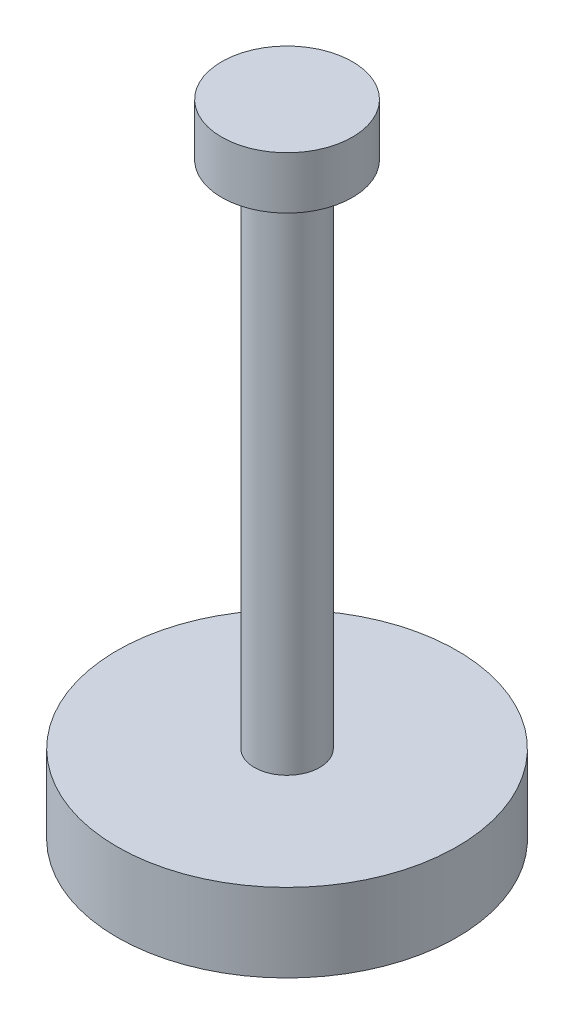
ISO-10303-21;
HEADER;
FILE_DESCRIPTION(('STEP AP214'),'2;1');
FILE_NAME('part.step','',(''),(''),'','','');
FILE_SCHEMA(('AUTOMOTIVE_DESIGN { 1 0 10303 214 1 1 1 1 }'));
ENDSEC;
DATA;
#1=APPLICATION_CONTEXT('core data for automotive mechanical design processes');
#2=APPLICATION_PROTOCOL_DEFINITION('international standard','automotive_design',2000,#1);
#3=PRODUCT_CONTEXT('',#1,'mechanical');
#4=PRODUCT('Part','Part','',(#3));
#5=PRODUCT_RELATED_PRODUCT_CATEGORY('part','',(#4));
#6=PRODUCT_DEFINITION_FORMATION('','',#4);
#7=PRODUCT_DEFINITION_CONTEXT('part definition',#1,'design');
#8=PRODUCT_DEFINITION('design','',#6,#7);
#9=PRODUCT_DEFINITION_SHAPE('','',#8);
#10=(LENGTH_UNIT() NAMED_UNIT(*) SI_UNIT(.MILLI.,.METRE.));
#11=(NAMED_UNIT(*) PLANE_ANGLE_UNIT() SI_UNIT($,.RADIAN.));
#12=(NAMED_UNIT(*) SI_UNIT($,.STERADIAN.) SOLID_ANGLE_UNIT());
#13=UNCERTAINTY_MEASURE_WITH_UNIT(LENGTH_MEASURE(1.E-05),#10,'distance_accuracy_value','');
#14=(GEOMETRIC_REPRESENTATION_CONTEXT(3) GLOBAL_UNCERTAINTY_ASSIGNED_CONTEXT((#13)) GLOBAL_UNIT_ASSIGNED_CONTEXT((#10,
#11,#12)) REPRESENTATION_CONTEXT('',''));
#15=CARTESIAN_POINT('',(0.,0.,0.));
#16=DIRECTION('',(0.,0.,1.));
#17=DIRECTION('',(1.,0.,0.));
#18=AXIS2_PLACEMENT_3D('',#15,#16,#17);
#19=CARTESIAN_POINT('',(0.,5.08,0.));
#20=DIRECTION('',(0.,-1.,0.));
#21=DIRECTION('',(0.,0.,-1.));
#22=AXIS2_PLACEMENT_3D('',#19,#20,#21);
#23=CYLINDRICAL_SURFACE('',#22,6.35);
#24=CARTESIAN_POINT('',(0.,5.08,0.));
#25=DIRECTION('',(0.,1.,0.));
#26=DIRECTION('',(0.,0.,1.));
#27=AXIS2_PLACEMENT_3D('',#24,#25,#26);
#28=CIRCLE('',#27,6.35);
#29=CARTESIAN_POINT('',(0.,5.08,6.35));
#30=VERTEX_POINT('',#29);
#31=EDGE_CURVE('E10',#30,#30,#28,.T.);
#32=ORIENTED_EDGE('',*,*,#31,.F.);
#33=EDGE_LOOP('',(#32));
#34=FACE_BOUND('',#33,.T.);
#35=CARTESIAN_POINT('',(0.,0.,0.));
#36=DIRECTION('',(0.,1.,0.));
#37=DIRECTION('',(0.,0.,1.));
#38=AXIS2_PLACEMENT_3D('',#35,#36,#37);
#39=CIRCLE('',#38,6.35);
#40=CARTESIAN_POINT('',(0.,0.,6.35));
#41=VERTEX_POINT('',#40);
#42=EDGE_CURVE('E42',#41,#41,#39,.T.);
#43=ORIENTED_EDGE('',*,*,#42,.T.);
#44=EDGE_LOOP('',(#43));
#45=FACE_BOUND('',#44,.T.);
#46=ADVANCED_FACE('F39',(#34,#45),#23,.T.);
#47=CARTESIAN_POINT('',(0.,5.08,0.));
#48=DIRECTION('',(0.,1.,0.));
#49=DIRECTION('',(0.,0.,1.));
#50=AXIS2_PLACEMENT_3D('',#47,#48,#49);
#51=PLANE('',#50);
#52=ORIENTED_EDGE('',*,*,#31,.T.);
#53=EDGE_LOOP('',(#52));
#54=FACE_BOUND('',#53,.T.);
#55=ADVANCED_FACE('F85',(#54),#51,.T.);
#56=CARTESIAN_POINT('',(0.,0.,0.));
#57=DIRECTION('',(0.,1.,0.));
#58=DIRECTION('',(0.,0.,1.));
#59=AXIS2_PLACEMENT_3D('',#56,#57,#58);
#60=PLANE('',#59);
#61=CARTESIAN_POINT('',(0.,0.,0.));
#62=DIRECTION('',(0.,1.,0.));
#63=DIRECTION('',(0.,0.,1.));
#64=AXIS2_PLACEMENT_3D('',#61,#62,#63);
#65=CIRCLE('',#64,3.175);
#66=CARTESIAN_POINT('',(0.,0.,3.175));
#67=VERTEX_POINT('',#66);
#68=EDGE_CURVE('E51',#67,#67,#65,.T.);
#69=ORIENTED_EDGE('',*,*,#68,.T.);
#70=EDGE_LOOP('',(#69));
#71=FACE_BOUND('',#70,.T.);
#72=ORIENTED_EDGE('',*,*,#42,.F.);
#73=EDGE_LOOP('',(#72));
#74=FACE_BOUND('',#73,.T.);
#75=ADVANCED_FACE('F90',(#71,#74),#60,.F.);
#76=CARTESIAN_POINT('',(0.,-49.53,0.));
#77=DIRECTION('',(0.,1.,0.));
#78=DIRECTION('',(0.,0.,1.));
#79=AXIS2_PLACEMENT_3D('',#76,#77,#78);
#80=CYLINDRICAL_SURFACE('',#79,3.175);
#81=CARTESIAN_POINT('',(0.,-49.53,0.));
#82=DIRECTION('',(0.,1.,0.));
#83=DIRECTION('',(0.,0.,1.));
#84=AXIS2_PLACEMENT_3D('',#81,#82,#83);
#85=CIRCLE('',#84,3.175);
#86=CARTESIAN_POINT('',(0.,-49.53,3.175));
#87=VERTEX_POINT('',#86);
#88=EDGE_CURVE('E56',#87,#87,#85,.T.);
#89=ORIENTED_EDGE('',*,*,#88,.T.);
#90=EDGE_LOOP('',(#89));
#91=FACE_BOUND('',#90,.T.);
#92=ORIENTED_EDGE('',*,*,#68,.F.);
#93=EDGE_LOOP('',(#92));
#94=FACE_BOUND('',#93,.T.);
#95=ADVANCED_FACE('F82',(#91,#94),#80,.T.);
#96=CARTESIAN_POINT('',(0.,-57.15,0.));
#97=DIRECTION('',(0.,1.,0.));
#98=DIRECTION('',(0.,0.,1.));
#99=AXIS2_PLACEMENT_3D('',#96,#97,#98);
#100=CYLINDRICAL_SURFACE('',#99,16.51);
#101=CARTESIAN_POINT('',(0.,-57.15,0.));
#102=DIRECTION('',(0.,1.,0.));
#103=DIRECTION('',(0.,0.,1.));
#104=AXIS2_PLACEMENT_3D('',#101,#102,#103);
#105=CIRCLE('',#104,16.51);
#106=CARTESIAN_POINT('',(0.,-57.15,16.51));
#107=VERTEX_POINT('',#106);
#108=EDGE_CURVE('E60',#107,#107,#105,.T.);
#109=CARTESIAN_POINT('',(0.,-49.53,0.));
#110=DIRECTION('',(0.,1.,0.));
#111=DIRECTION('',(0.,0.,1.));
#112=AXIS2_PLACEMENT_3D('',#109,#110,#111);
#113=CIRCLE('',#112,16.51);
#114=CARTESIAN_POINT('',(0.,-49.53,16.51));
#115=VERTEX_POINT('',#114);
#116=EDGE_CURVE('E61',#115,#115,#113,.T.);
#117=CARTESIAN_POINT('',(0.,-57.15,16.51));
#118=CARTESIAN_POINT('',(0.,-57.070625,16.51));
#119=CARTESIAN_POINT('',(0.,-56.99125,16.51));
#120=CARTESIAN_POINT('',(0.,-56.8325,16.51));
#121=CARTESIAN_POINT('',(0.,-56.753125,16.51));
#122=CARTESIAN_POINT('',(0.,-56.594375,16.51));
#123=CARTESIAN_POINT('',(0.,-56.515,16.51));
#124=CARTESIAN_POINT('',(0.,-56.35625,16.51));
#125=CARTESIAN_POINT('',(0.,-56.276875,16.51));
#126=CARTESIAN_POINT('',(0.,-56.118125,16.51));
#127=CARTESIAN_POINT('',(0.,-56.03875,16.51));
#128=CARTESIAN_POINT('',(0.,-55.88,16.51));
#129=CARTESIAN_POINT('',(0.,-55.800625,16.51));
#130=CARTESIAN_POINT('',(0.,-55.641875,16.51));
#131=CARTESIAN_POINT('',(0.,-55.5625,16.51));
#132=CARTESIAN_POINT('',(0.,-55.40375,16.51));
#133=CARTESIAN_POINT('',(0.,-55.324375,16.51));
#134=CARTESIAN_POINT('',(0.,-55.165625,16.51));
#135=CARTESIAN_POINT('',(0.,-55.08625,16.51));
#136=CARTESIAN_POINT('',(0.,-54.9275,16.51));
#137=CARTESIAN_POINT('',(0.,-54.848125,16.51));
#138=CARTESIAN_POINT('',(0.,-54.689375,16.51));
#139=CARTESIAN_POINT('',(0.,-54.61,16.51));
#140=CARTESIAN_POINT('',(0.,-54.45125,16.51));
#141=CARTESIAN_POINT('',(0.,-54.371875,16.51));
#142=CARTESIAN_POINT('',(0.,-54.213125,16.51));
#143=CARTESIAN_POINT('',(0.,-54.13375,16.51));
#144=CARTESIAN_POINT('',(0.,-53.975,16.51));
#145=CARTESIAN_POINT('',(0.,-53.895625,16.51));
#146=CARTESIAN_POINT('',(0.,-53.736875,16.51));
#147=CARTESIAN_POINT('',(0.,-53.6575,16.51));
#148=CARTESIAN_POINT('',(0.,-53.49875,16.51));
#149=CARTESIAN_POINT('',(0.,-53.419375,16.51));
#150=CARTESIAN_POINT('',(0.,-53.260625,16.51));
#151=CARTESIAN_POINT('',(0.,-53.18125,16.51));
#152=CARTESIAN_POINT('',(0.,-53.0225,16.51));
#153=CARTESIAN_POINT('',(0.,-52.943125,16.51));
#154=CARTESIAN_POINT('',(0.,-52.784375,16.51));
#155=CARTESIAN_POINT('',(0.,-52.705,16.51));
#156=CARTESIAN_POINT('',(0.,-52.54625,16.51));
#157=CARTESIAN_POINT('',(0.,-52.466875,16.51));
#158=CARTESIAN_POINT('',(0.,-52.308125,16.51));
#159=CARTESIAN_POINT('',(0.,-52.22875,16.51));
#160=CARTESIAN_POINT('',(0.,-52.07,16.51));
#161=CARTESIAN_POINT('',(0.,-51.990625,16.51));
#162=CARTESIAN_POINT('',(0.,-51.831875,16.51));
#163=CARTESIAN_POINT('',(0.,-51.7525,16.51));
#164=CARTESIAN_POINT('',(0.,-51.59375,16.51));
#165=CARTESIAN_POINT('',(0.,-51.514375,16.51));
#166=CARTESIAN_POINT('',(0.,-51.355625,16.51));
#167=CARTESIAN_POINT('',(0.,-51.27625,16.51));
#168=CARTESIAN_POINT('',(0.,-51.1175,16.51));
#169=CARTESIAN_POINT('',(0.,-51.038125,16.51));
#170=CARTESIAN_POINT('',(0.,-50.879375,16.51));
#171=CARTESIAN_POINT('',(0.,-50.8,16.51));
#172=CARTESIAN_POINT('',(0.,-50.64125,16.51));
#173=CARTESIAN_POINT('',(0.,-50.561875,16.51));
#174=CARTESIAN_POINT('',(0.,-50.403125,16.51));
#175=CARTESIAN_POINT('',(0.,-50.32375,16.51));
#176=CARTESIAN_POINT('',(0.,-50.165,16.51));
#177=CARTESIAN_POINT('',(0.,-50.085625,16.51));
#178=CARTESIAN_POINT('',(0.,-49.926875,16.51));
#179=CARTESIAN_POINT('',(0.,-49.8475,16.51));
#180=CARTESIAN_POINT('',(0.,-49.68875,16.51));
#181=CARTESIAN_POINT('',(0.,-49.609375,16.51));
#182=CARTESIAN_POINT('',(0.,-49.53,16.51));
#183=B_SPLINE_CURVE_WITH_KNOTS('',3,(#117,#118,#119,#120,#121,#122,#123,#124,#125,#126,#127,
#128,#129,#130,#131,#132,#133,#134,#135,#136,#137,#138,#139,#140,#141,#142,#143,#144,#145,#146,
#147,#148,#149,#150,#151,#152,#153,#154,#155,#156,#157,#158,#159,#160,#161,#162,#163,#164,#165,
#166,#167,#168,#169,#170,#171,#172,#173,#174,#175,#176,#177,#178,#179,#180,#181,#182),
.UNSPECIFIED.,.F.,.F.,(4,2,2,2,2,2,2,2,2,2,2,2,2,2,2,2,2,2,2,2,2,2,2,2,2,2,2,2,2,2,2,2,4),(0.,
0.238125000000006,0.476250000000004,0.714375000000003,0.952500000000002,1.190625,
1.42875000000001,1.66687500000001,1.905,2.143125,2.38125,2.61937500000001,2.85750000000001,
3.095625,3.33375,3.571875,3.81000000000001,4.04812500000001,4.28625000000001,4.524375,4.7625,
5.00062500000001,5.23875000000001,5.47687500000001,5.71500000000001,5.953125,6.19125000000001,
6.42937500000001,6.66750000000001,6.90562500000001,7.14375,7.381875,7.62000000000001),.UNSPECIFIED.);
#184=EDGE_CURVE('BSEAM69',#107,#115,#183,.T.);
#185=ORIENTED_EDGE('',*,*,#108,.T.);
#186=ORIENTED_EDGE('',*,*,#116,.F.);
#187=ORIENTED_EDGE('',*,*,#184,.T.);
#188=ORIENTED_EDGE('',*,*,#184,.F.);
#189=EDGE_LOOP('',(#185,#187,#186,#188));
#190=FACE_BOUND('',#189,.T.);
#191=ADVANCED_FACE('F69',(#190),#100,.T.);
#192=CARTESIAN_POINT('',(0.,-57.15,0.));
#193=DIRECTION('',(0.,1.,0.));
#194=DIRECTION('',(0.,0.,1.));
#195=AXIS2_PLACEMENT_3D('',#192,#193,#194);
#196=PLANE('',#195);
#197=ORIENTED_EDGE('',*,*,#108,.F.);
#198=EDGE_LOOP('',(#197));
#199=FACE_BOUND('',#198,.T.);
#200=ADVANCED_FACE('F72',(#199),#196,.F.);
#201=CARTESIAN_POINT('',(0.,-49.53,0.));
#202=DIRECTION('',(0.,1.,0.));
#203=DIRECTION('',(0.,0.,1.));
#204=AXIS2_PLACEMENT_3D('',#201,#202,#203);
#205=PLANE('',#204);
#206=ORIENTED_EDGE('',*,*,#88,.F.);
#207=EDGE_LOOP('',(#206));
#208=FACE_BOUND('',#207,.T.);
#209=ORIENTED_EDGE('',*,*,#116,.T.);
#210=EDGE_LOOP('',(#209));
#211=FACE_BOUND('',#210,.T.);
#212=ADVANCED_FACE('F74',(#208,#211),#205,.T.);
#213=CLOSED_SHELL('',(#46,#55,#75,#95,#191,#200,#212));
#214=MANIFOLD_SOLID_BREP('B2',#213);
#215=ADVANCED_BREP_SHAPE_REPRESENTATION('',(#18,#214),#14);
#216=SHAPE_DEFINITION_REPRESENTATION(#9,#215);
ENDSEC;
END-ISO-10303-21;
